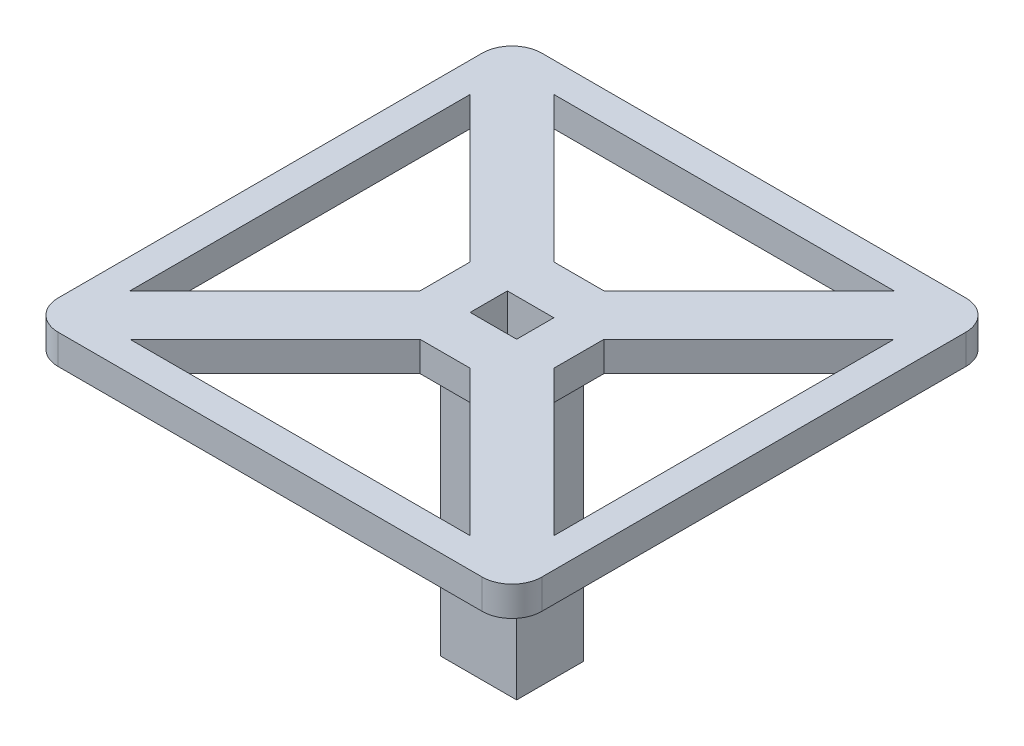
ISO-10303-21;
HEADER;
FILE_DESCRIPTION(('STEP AP214'),'2;1');
FILE_NAME('part.step','',(''),(''),'','','');
FILE_SCHEMA(('AUTOMOTIVE_DESIGN { 1 0 10303 214 1 1 1 1 }'));
ENDSEC;
DATA;
#1=APPLICATION_CONTEXT('core data for automotive mechanical design processes');
#2=APPLICATION_PROTOCOL_DEFINITION('international standard','automotive_design',2000,#1);
#3=PRODUCT_CONTEXT('',#1,'mechanical');
#4=PRODUCT('Part','Part','',(#3));
#5=PRODUCT_RELATED_PRODUCT_CATEGORY('part','',(#4));
#6=PRODUCT_DEFINITION_FORMATION('','',#4);
#7=PRODUCT_DEFINITION_CONTEXT('part definition',#1,'design');
#8=PRODUCT_DEFINITION('design','',#6,#7);
#9=PRODUCT_DEFINITION_SHAPE('','',#8);
#10=(LENGTH_UNIT() NAMED_UNIT(*) SI_UNIT(.MILLI.,.METRE.));
#11=(NAMED_UNIT(*) PLANE_ANGLE_UNIT() SI_UNIT($,.RADIAN.));
#12=(NAMED_UNIT(*) SI_UNIT($,.STERADIAN.) SOLID_ANGLE_UNIT());
#13=UNCERTAINTY_MEASURE_WITH_UNIT(LENGTH_MEASURE(1.E-05),#10,'distance_accuracy_value','');
#14=(GEOMETRIC_REPRESENTATION_CONTEXT(3) GLOBAL_UNCERTAINTY_ASSIGNED_CONTEXT((#13)) GLOBAL_UNIT_ASSIGNED_CONTEXT((#10,
#11,#12)) REPRESENTATION_CONTEXT('',''));
#15=CARTESIAN_POINT('',(0.,0.,0.));
#16=DIRECTION('',(0.,0.,1.));
#17=DIRECTION('',(1.,0.,0.));
#18=AXIS2_PLACEMENT_3D('',#15,#16,#17);
#19=CARTESIAN_POINT('',(0.,25.4,0.));
#20=DIRECTION('',(0.,-1.,0.));
#21=DIRECTION('',(0.,0.,-1.));
#22=AXIS2_PLACEMENT_3D('',#19,#20,#21);
#23=PLANE('',#22);
#24=DIRECTION('',(-0.707106781186547,0.,-0.707106781186547));
#25=VECTOR('',#24,1.);
#26=CARTESIAN_POINT('',(14.5053975515723,25.4,18.0975));
#27=LINE('',#26,#25);
#28=CARTESIAN_POINT('',(14.5053975515723,25.4,18.0975));
#29=VERTEX_POINT('',#28);
#30=CARTESIAN_POINT('',(2.12289755157234,25.4,5.715));
#31=VERTEX_POINT('',#30);
#32=EDGE_CURVE('E279',#29,#31,#27,.T.);
#33=ORIENTED_EDGE('',*,*,#32,.F.);
#34=DIRECTION('',(1.,0.,0.));
#35=VECTOR('',#34,1.);
#36=CARTESIAN_POINT('',(-14.5053975515723,25.4,18.0975));
#37=LINE('',#36,#35);
#38=CARTESIAN_POINT('',(-14.5053975515723,25.4,18.0975));
#39=VERTEX_POINT('',#38);
#40=EDGE_CURVE('E275',#39,#29,#37,.T.);
#41=ORIENTED_EDGE('',*,*,#40,.F.);
#42=DIRECTION('',(-0.707106781186548,0.,0.707106781186548));
#43=VECTOR('',#42,1.);
#44=CARTESIAN_POINT('',(-14.5053975515723,25.4,18.0975));
#45=LINE('',#44,#43);
#46=CARTESIAN_POINT('',(-2.12289755157233,25.4,5.715));
#47=VERTEX_POINT('',#46);
#48=EDGE_CURVE('E285',#47,#39,#45,.T.);
#49=ORIENTED_EDGE('',*,*,#48,.F.);
#50=DIRECTION('',(-1.,0.,0.));
#51=VECTOR('',#50,1.);
#52=CARTESIAN_POINT('',(-2.12289755157233,25.4,5.715));
#53=LINE('',#52,#51);
#54=EDGE_CURVE('E282',#31,#47,#53,.T.);
#55=ORIENTED_EDGE('',*,*,#54,.F.);
#56=EDGE_LOOP('',(#33,#41,#49,#55));
#57=FACE_BOUND('',#56,.T.);
#58=DIRECTION('',(-0.707106781186547,0.,-0.707106781186547));
#59=VECTOR('',#58,1.);
#60=CARTESIAN_POINT('',(-5.715,25.4,-2.12289755157233));
#61=LINE('',#60,#59);
#62=CARTESIAN_POINT('',(-5.715,25.4,-2.12289755157233));
#63=VERTEX_POINT('',#62);
#64=CARTESIAN_POINT('',(-18.0975,25.4,-14.5053975515723));
#65=VERTEX_POINT('',#64);
#66=EDGE_CURVE('E299',#63,#65,#61,.T.);
#67=ORIENTED_EDGE('',*,*,#66,.F.);
#68=DIRECTION('',(0.,0.,-1.));
#69=VECTOR('',#68,1.);
#70=CARTESIAN_POINT('',(-5.715,25.4,2.12289755157234));
#71=LINE('',#70,#69);
#72=CARTESIAN_POINT('',(-5.715,25.4,2.12289755157234));
#73=VERTEX_POINT('',#72);
#74=EDGE_CURVE('E291',#73,#63,#71,.T.);
#75=ORIENTED_EDGE('',*,*,#74,.F.);
#76=DIRECTION('',(0.707106781186547,0.,-0.707106781186547));
#77=VECTOR('',#76,1.);
#78=CARTESIAN_POINT('',(-18.0975,25.4,14.5053975515723));
#79=LINE('',#78,#77);
#80=CARTESIAN_POINT('',(-18.0975,25.4,14.5053975515723));
#81=VERTEX_POINT('',#80);
#82=EDGE_CURVE('E305',#81,#73,#79,.T.);
#83=ORIENTED_EDGE('',*,*,#82,.F.);
#84=DIRECTION('',(0.,0.,1.));
#85=VECTOR('',#84,1.);
#86=CARTESIAN_POINT('',(-18.0975,25.4,-14.5053975515723));
#87=LINE('',#86,#85);
#88=EDGE_CURVE('E302',#65,#81,#87,.T.);
#89=ORIENTED_EDGE('',*,*,#88,.F.);
#90=EDGE_LOOP('',(#67,#75,#83,#89));
#91=FACE_BOUND('',#90,.T.);
#92=DIRECTION('',(-0.707106781186548,0.,0.707106781186548));
#93=VECTOR('',#92,1.);
#94=CARTESIAN_POINT('',(18.0975,25.4,-14.5053975515723));
#95=LINE('',#94,#93);
#96=CARTESIAN_POINT('',(18.0975,25.4,-14.5053975515723));
#97=VERTEX_POINT('',#96);
#98=CARTESIAN_POINT('',(5.715,25.4,-2.12289755157233));
#99=VERTEX_POINT('',#98);
#100=EDGE_CURVE('E259',#97,#99,#95,.T.);
#101=ORIENTED_EDGE('',*,*,#100,.F.);
#102=DIRECTION('',(0.,0.,-1.));
#103=VECTOR('',#102,1.);
#104=CARTESIAN_POINT('',(18.0975,25.4,-14.5053975515723));
#105=LINE('',#104,#103);
#106=CARTESIAN_POINT('',(18.0975,25.4,14.5053975515723));
#107=VERTEX_POINT('',#106);
#108=EDGE_CURVE('E264',#107,#97,#105,.T.);
#109=ORIENTED_EDGE('',*,*,#108,.F.);
#110=DIRECTION('',(0.707106781186547,0.,0.707106781186547));
#111=VECTOR('',#110,1.);
#112=CARTESIAN_POINT('',(18.0975,25.4,14.5053975515723));
#113=LINE('',#112,#111);
#114=CARTESIAN_POINT('',(5.715,25.4,2.12289755157234));
#115=VERTEX_POINT('',#114);
#116=EDGE_CURVE('E268',#115,#107,#113,.T.);
#117=ORIENTED_EDGE('',*,*,#116,.F.);
#118=DIRECTION('',(0.,0.,1.));
#119=VECTOR('',#118,1.);
#120=CARTESIAN_POINT('',(5.715,25.4,2.12289755157234));
#121=LINE('',#120,#119);
#122=EDGE_CURVE('E248',#99,#115,#121,.T.);
#123=ORIENTED_EDGE('',*,*,#122,.F.);
#124=EDGE_LOOP('',(#101,#109,#117,#123));
#125=FACE_BOUND('',#124,.T.);
#126=DIRECTION('',(0.707106781186548,0.,-0.707106781186548));
#127=VECTOR('',#126,1.);
#128=CARTESIAN_POINT('',(14.5053975515723,25.4,-18.0975));
#129=LINE('',#128,#127);
#130=CARTESIAN_POINT('',(2.12289755157234,25.4,-5.715));
#131=VERTEX_POINT('',#130);
#132=CARTESIAN_POINT('',(14.5053975515723,25.4,-18.0975));
#133=VERTEX_POINT('',#132);
#134=EDGE_CURVE('E319',#131,#133,#129,.T.);
#135=ORIENTED_EDGE('',*,*,#134,.F.);
#136=DIRECTION('',(1.,0.,0.));
#137=VECTOR('',#136,1.);
#138=CARTESIAN_POINT('',(-2.12289755157234,25.4,-5.715));
#139=LINE('',#138,#137);
#140=CARTESIAN_POINT('',(-2.12289755157234,25.4,-5.715));
#141=VERTEX_POINT('',#140);
#142=EDGE_CURVE('E311',#141,#131,#139,.T.);
#143=ORIENTED_EDGE('',*,*,#142,.F.);
#144=DIRECTION('',(0.707106781186548,0.,0.707106781186547));
#145=VECTOR('',#144,1.);
#146=CARTESIAN_POINT('',(-2.12289755157234,25.4,-5.715));
#147=LINE('',#146,#145);
#148=CARTESIAN_POINT('',(-14.5053975515723,25.4,-18.0975));
#149=VERTEX_POINT('',#148);
#150=EDGE_CURVE('E325',#149,#141,#147,.T.);
#151=ORIENTED_EDGE('',*,*,#150,.F.);
#152=DIRECTION('',(-1.,0.,0.));
#153=VECTOR('',#152,1.);
#154=CARTESIAN_POINT('',(-14.5053975515723,25.4,-18.0975));
#155=LINE('',#154,#153);
#156=EDGE_CURVE('E322',#133,#149,#155,.T.);
#157=ORIENTED_EDGE('',*,*,#156,.F.);
#158=EDGE_LOOP('',(#135,#143,#151,#157));
#159=FACE_BOUND('',#158,.T.);
#160=DIRECTION('',(0.,0.,-1.));
#161=VECTOR('',#160,1.);
#162=CARTESIAN_POINT('',(1.984375,25.4,1.5875));
#163=LINE('',#162,#161);
#164=CARTESIAN_POINT('',(1.984375,25.4,1.5875));
#165=VERTEX_POINT('',#164);
#166=CARTESIAN_POINT('',(1.984375,25.4,-1.5875));
#167=VERTEX_POINT('',#166);
#168=EDGE_CURVE('E369',#165,#167,#163,.T.);
#169=ORIENTED_EDGE('',*,*,#168,.F.);
#170=DIRECTION('',(1.,0.,0.));
#171=VECTOR('',#170,1.);
#172=CARTESIAN_POINT('',(-1.984375,25.4,1.5875));
#173=LINE('',#172,#171);
#174=CARTESIAN_POINT('',(-1.984375,25.4,1.5875));
#175=VERTEX_POINT('',#174);
#176=EDGE_CURVE('E377',#175,#165,#173,.T.);
#177=ORIENTED_EDGE('',*,*,#176,.F.);
#178=DIRECTION('',(0.,0.,1.));
#179=VECTOR('',#178,1.);
#180=CARTESIAN_POINT('',(-1.984375,25.4,1.5875));
#181=LINE('',#180,#179);
#182=CARTESIAN_POINT('',(-1.984375,25.4,-1.5875));
#183=VERTEX_POINT('',#182);
#184=EDGE_CURVE('E374',#183,#175,#181,.T.);
#185=ORIENTED_EDGE('',*,*,#184,.F.);
#186=DIRECTION('',(-1.,0.,0.));
#187=VECTOR('',#186,1.);
#188=CARTESIAN_POINT('',(-1.984375,25.4,-1.5875));
#189=LINE('',#188,#187);
#190=EDGE_CURVE('E371',#167,#183,#189,.T.);
#191=ORIENTED_EDGE('',*,*,#190,.F.);
#192=EDGE_LOOP('',(#169,#177,#185,#191));
#193=FACE_BOUND('',#192,.T.);
#194=DIRECTION('',(0.,0.,-1.));
#195=VECTOR('',#194,1.);
#196=CARTESIAN_POINT('',(20.6375,25.4,20.6375));
#197=LINE('',#196,#195);
#198=CARTESIAN_POINT('',(20.6375,25.4,18.0975));
#199=VERTEX_POINT('',#198);
#200=CARTESIAN_POINT('',(20.6375,25.4,-18.0975));
#201=VERTEX_POINT('',#200);
#202=EDGE_CURVE('E345',#199,#201,#197,.T.);
#203=ORIENTED_EDGE('',*,*,#202,.T.);
#204=CARTESIAN_POINT('',(18.0975,25.4,-18.0975));
#205=DIRECTION('',(0.,-1.,0.));
#206=DIRECTION('',(0.,0.,-1.));
#207=AXIS2_PLACEMENT_3D('',#204,#205,#206);
#208=CIRCLE('',#207,2.54);
#209=CARTESIAN_POINT('',(18.0975,25.4,-20.6375));
#210=VERTEX_POINT('',#209);
#211=EDGE_CURVE('E464',#201,#210,#208,.F.);
#212=ORIENTED_EDGE('',*,*,#211,.T.);
#213=DIRECTION('',(-1.,0.,0.));
#214=VECTOR('',#213,1.);
#215=CARTESIAN_POINT('',(-20.6375,25.4,-20.6375));
#216=LINE('',#215,#214);
#217=CARTESIAN_POINT('',(-18.0975,25.4,-20.6375));
#218=VERTEX_POINT('',#217);
#219=EDGE_CURVE('E361',#210,#218,#216,.T.);
#220=ORIENTED_EDGE('',*,*,#219,.T.);
#221=CARTESIAN_POINT('',(-18.0975,25.4,-18.0975));
#222=DIRECTION('',(0.,-1.,0.));
#223=DIRECTION('',(0.,0.,-1.));
#224=AXIS2_PLACEMENT_3D('',#221,#222,#223);
#225=CIRCLE('',#224,2.54);
#226=CARTESIAN_POINT('',(-20.6375,25.4,-18.0975));
#227=VERTEX_POINT('',#226);
#228=EDGE_CURVE('E458',#218,#227,#225,.F.);
#229=ORIENTED_EDGE('',*,*,#228,.T.);
#230=DIRECTION('',(0.,0.,1.));
#231=VECTOR('',#230,1.);
#232=CARTESIAN_POINT('',(-20.6375,25.4,20.6375));
#233=LINE('',#232,#231);
#234=CARTESIAN_POINT('',(-20.6375,25.4,18.0975));
#235=VERTEX_POINT('',#234);
#236=EDGE_CURVE('E364',#227,#235,#233,.T.);
#237=ORIENTED_EDGE('',*,*,#236,.T.);
#238=CARTESIAN_POINT('',(-18.0975,25.4,18.0975));
#239=DIRECTION('',(0.,-1.,0.));
#240=DIRECTION('',(0.,0.,-1.));
#241=AXIS2_PLACEMENT_3D('',#238,#239,#240);
#242=CIRCLE('',#241,2.54);
#243=CARTESIAN_POINT('',(-18.0975,25.4,20.6375));
#244=VERTEX_POINT('',#243);
#245=EDGE_CURVE('E460',#235,#244,#242,.F.);
#246=ORIENTED_EDGE('',*,*,#245,.T.);
#247=DIRECTION('',(1.,0.,0.));
#248=VECTOR('',#247,1.);
#249=CARTESIAN_POINT('',(-20.6375,25.4,20.6375));
#250=LINE('',#249,#248);
#251=CARTESIAN_POINT('',(18.0975,25.4,20.6375));
#252=VERTEX_POINT('',#251);
#253=EDGE_CURVE('E350',#244,#252,#250,.T.);
#254=ORIENTED_EDGE('',*,*,#253,.T.);
#255=CARTESIAN_POINT('',(18.0975,25.4,18.0975));
#256=DIRECTION('',(0.,-1.,0.));
#257=DIRECTION('',(0.,0.,-1.));
#258=AXIS2_PLACEMENT_3D('',#255,#256,#257);
#259=CIRCLE('',#258,2.54);
#260=EDGE_CURVE('E462',#252,#199,#259,.F.);
#261=ORIENTED_EDGE('',*,*,#260,.T.);
#262=EDGE_LOOP('',(#203,#212,#220,#229,#237,#246,#254,#261));
#263=FACE_BOUND('',#262,.T.);
#264=ADVANCED_FACE('F33',(#57,#91,#125,#159,#193,#263),#23,.F.);
#265=CARTESIAN_POINT('',(0.,0.,0.));
#266=DIRECTION('',(0.,-1.,0.));
#267=DIRECTION('',(0.,0.,-1.));
#268=AXIS2_PLACEMENT_3D('',#265,#266,#267);
#269=PLANE('',#268);
#270=DIRECTION('',(0.,0.,-1.));
#271=VECTOR('',#270,1.);
#272=CARTESIAN_POINT('',(3.254375,0.,2.8575));
#273=LINE('',#272,#271);
#274=CARTESIAN_POINT('',(3.254375,0.,2.8575));
#275=VERTEX_POINT('',#274);
#276=CARTESIAN_POINT('',(3.254375,0.,-2.8575));
#277=VERTEX_POINT('',#276);
#278=EDGE_CURVE('E399',#275,#277,#273,.T.);
#279=ORIENTED_EDGE('',*,*,#278,.F.);
#280=DIRECTION('',(1.,0.,0.));
#281=VECTOR('',#280,1.);
#282=CARTESIAN_POINT('',(-3.254375,0.,2.8575));
#283=LINE('',#282,#281);
#284=CARTESIAN_POINT('',(-3.254375,0.,2.8575));
#285=VERTEX_POINT('',#284);
#286=EDGE_CURVE('E408',#285,#275,#283,.T.);
#287=ORIENTED_EDGE('',*,*,#286,.F.);
#288=DIRECTION('',(0.,0.,1.));
#289=VECTOR('',#288,1.);
#290=CARTESIAN_POINT('',(-3.254375,0.,2.8575));
#291=LINE('',#290,#289);
#292=CARTESIAN_POINT('',(-3.254375,0.,-2.8575));
#293=VERTEX_POINT('',#292);
#294=EDGE_CURVE('E405',#293,#285,#291,.T.);
#295=ORIENTED_EDGE('',*,*,#294,.F.);
#296=DIRECTION('',(-1.,0.,0.));
#297=VECTOR('',#296,1.);
#298=CARTESIAN_POINT('',(-3.254375,0.,-2.8575));
#299=LINE('',#298,#297);
#300=EDGE_CURVE('E402',#277,#293,#299,.T.);
#301=ORIENTED_EDGE('',*,*,#300,.F.);
#302=EDGE_LOOP('',(#279,#287,#295,#301));
#303=FACE_BOUND('',#302,.T.);
#304=DIRECTION('',(1.,0.,0.));
#305=VECTOR('',#304,1.);
#306=CARTESIAN_POINT('',(-1.984375,0.,1.5875));
#307=LINE('',#306,#305);
#308=CARTESIAN_POINT('',(-1.984375,0.,1.5875));
#309=VERTEX_POINT('',#308);
#310=CARTESIAN_POINT('',(1.984375,0.,1.5875));
#311=VERTEX_POINT('',#310);
#312=EDGE_CURVE('E372',#309,#311,#307,.T.);
#313=ORIENTED_EDGE('',*,*,#312,.T.);
#314=DIRECTION('',(0.,0.,-1.));
#315=VECTOR('',#314,1.);
#316=CARTESIAN_POINT('',(1.984375,0.,1.5875));
#317=LINE('',#316,#315);
#318=CARTESIAN_POINT('',(1.984375,0.,-1.5875));
#319=VERTEX_POINT('',#318);
#320=EDGE_CURVE('E358',#311,#319,#317,.T.);
#321=ORIENTED_EDGE('',*,*,#320,.T.);
#322=DIRECTION('',(-1.,0.,0.));
#323=VECTOR('',#322,1.);
#324=CARTESIAN_POINT('',(-1.984375,0.,-1.5875));
#325=LINE('',#324,#323);
#326=CARTESIAN_POINT('',(-1.984375,0.,-1.5875));
#327=VERTEX_POINT('',#326);
#328=EDGE_CURVE('E382',#319,#327,#325,.T.);
#329=ORIENTED_EDGE('',*,*,#328,.T.);
#330=DIRECTION('',(0.,0.,1.));
#331=VECTOR('',#330,1.);
#332=CARTESIAN_POINT('',(-1.984375,0.,1.5875));
#333=LINE('',#332,#331);
#334=EDGE_CURVE('E385',#327,#309,#333,.T.);
#335=ORIENTED_EDGE('',*,*,#334,.T.);
#336=EDGE_LOOP('',(#313,#321,#329,#335));
#337=FACE_BOUND('',#336,.T.);
#338=ADVANCED_FACE('F522',(#303,#337),#269,.T.);
#339=CARTESIAN_POINT('',(3.254375,25.4,2.8575));
#340=DIRECTION('',(-1.,0.,0.));
#341=DIRECTION('',(0.,0.,1.));
#342=AXIS2_PLACEMENT_3D('',#339,#340,#341);
#343=PLANE('',#342);
#344=DIRECTION('',(0.,-1.,0.));
#345=VECTOR('',#344,1.);
#346=CARTESIAN_POINT('',(3.254375,25.4,-2.8575));
#347=LINE('',#346,#345);
#348=CARTESIAN_POINT('',(3.254375,22.86,-2.8575));
#349=VERTEX_POINT('',#348);
#350=EDGE_CURVE('E417',#349,#277,#347,.T.);
#351=ORIENTED_EDGE('',*,*,#350,.F.);
#352=DIRECTION('',(0.,0.,-1.));
#353=VECTOR('',#352,1.);
#354=CARTESIAN_POINT('',(3.254375,22.86,2.8575));
#355=LINE('',#354,#353);
#356=CARTESIAN_POINT('',(3.254375,22.86,2.8575));
#357=VERTEX_POINT('',#356);
#358=EDGE_CURVE('E341',#357,#349,#355,.T.);
#359=ORIENTED_EDGE('',*,*,#358,.F.);
#360=DIRECTION('',(0.,-1.,0.));
#361=VECTOR('',#360,1.);
#362=CARTESIAN_POINT('',(3.254375,25.4,2.8575));
#363=LINE('',#362,#361);
#364=EDGE_CURVE('E411',#357,#275,#363,.T.);
#365=ORIENTED_EDGE('',*,*,#364,.T.);
#366=ORIENTED_EDGE('',*,*,#278,.T.);
#367=EDGE_LOOP('',(#351,#359,#365,#366));
#368=FACE_BOUND('',#367,.T.);
#369=ADVANCED_FACE('F528',(#368),#343,.F.);
#370=CARTESIAN_POINT('',(-3.254375,25.4,-2.8575));
#371=DIRECTION('',(0.,0.,1.));
#372=DIRECTION('',(1.,0.,0.));
#373=AXIS2_PLACEMENT_3D('',#370,#371,#372);
#374=PLANE('',#373);
#375=DIRECTION('',(0.,-1.,0.));
#376=VECTOR('',#375,1.);
#377=CARTESIAN_POINT('',(-3.254375,25.4,-2.8575));
#378=LINE('',#377,#376);
#379=CARTESIAN_POINT('',(-3.254375,22.86,-2.8575));
#380=VERTEX_POINT('',#379);
#381=EDGE_CURVE('E415',#380,#293,#378,.T.);
#382=ORIENTED_EDGE('',*,*,#381,.F.);
#383=DIRECTION('',(-1.,0.,0.));
#384=VECTOR('',#383,1.);
#385=CARTESIAN_POINT('',(3.254375,22.86,-2.8575));
#386=LINE('',#385,#384);
#387=EDGE_CURVE('E343',#349,#380,#386,.T.);
#388=ORIENTED_EDGE('',*,*,#387,.F.);
#389=ORIENTED_EDGE('',*,*,#350,.T.);
#390=ORIENTED_EDGE('',*,*,#300,.T.);
#391=EDGE_LOOP('',(#382,#388,#389,#390));
#392=FACE_BOUND('',#391,.T.);
#393=ADVANCED_FACE('F544',(#392),#374,.F.);
#394=CARTESIAN_POINT('',(-3.254375,25.4,2.8575));
#395=DIRECTION('',(1.,0.,0.));
#396=DIRECTION('',(0.,0.,-1.));
#397=AXIS2_PLACEMENT_3D('',#394,#395,#396);
#398=PLANE('',#397);
#399=DIRECTION('',(0.,-1.,0.));
#400=VECTOR('',#399,1.);
#401=CARTESIAN_POINT('',(-3.254375,25.4,2.8575));
#402=LINE('',#401,#400);
#403=CARTESIAN_POINT('',(-3.254375,22.86,2.8575));
#404=VERTEX_POINT('',#403);
#405=EDGE_CURVE('E413',#404,#285,#402,.T.);
#406=ORIENTED_EDGE('',*,*,#405,.F.);
#407=DIRECTION('',(0.,0.,1.));
#408=VECTOR('',#407,1.);
#409=CARTESIAN_POINT('',(-3.254375,22.86,-2.8575));
#410=LINE('',#409,#408);
#411=EDGE_CURVE('E331',#380,#404,#410,.T.);
#412=ORIENTED_EDGE('',*,*,#411,.F.);
#413=ORIENTED_EDGE('',*,*,#381,.T.);
#414=ORIENTED_EDGE('',*,*,#294,.T.);
#415=EDGE_LOOP('',(#406,#412,#413,#414));
#416=FACE_BOUND('',#415,.T.);
#417=ADVANCED_FACE('F540',(#416),#398,.F.);
#418=CARTESIAN_POINT('',(-3.254375,25.4,2.8575));
#419=DIRECTION('',(0.,0.,-1.));
#420=DIRECTION('',(-1.,0.,0.));
#421=AXIS2_PLACEMENT_3D('',#418,#419,#420);
#422=PLANE('',#421);
#423=ORIENTED_EDGE('',*,*,#364,.F.);
#424=DIRECTION('',(1.,0.,0.));
#425=VECTOR('',#424,1.);
#426=CARTESIAN_POINT('',(-3.254375,22.86,2.8575));
#427=LINE('',#426,#425);
#428=EDGE_CURVE('E339',#404,#357,#427,.T.);
#429=ORIENTED_EDGE('',*,*,#428,.F.);
#430=ORIENTED_EDGE('',*,*,#405,.T.);
#431=ORIENTED_EDGE('',*,*,#286,.T.);
#432=EDGE_LOOP('',(#423,#429,#430,#431));
#433=FACE_BOUND('',#432,.T.);
#434=ADVANCED_FACE('F537',(#433),#422,.F.);
#435=CARTESIAN_POINT('',(1.984375,25.4,1.5875));
#436=DIRECTION('',(-1.,0.,0.));
#437=DIRECTION('',(0.,0.,1.));
#438=AXIS2_PLACEMENT_3D('',#435,#436,#437);
#439=PLANE('',#438);
#440=ORIENTED_EDGE('',*,*,#320,.F.);
#441=DIRECTION('',(0.,-1.,0.));
#442=VECTOR('',#441,1.);
#443=CARTESIAN_POINT('',(1.984375,25.4,1.5875));
#444=LINE('',#443,#442);
#445=EDGE_CURVE('E379',#165,#311,#444,.T.);
#446=ORIENTED_EDGE('',*,*,#445,.F.);
#447=ORIENTED_EDGE('',*,*,#168,.T.);
#448=DIRECTION('',(0.,-1.,0.));
#449=VECTOR('',#448,1.);
#450=CARTESIAN_POINT('',(1.984375,25.4,-1.5875));
#451=LINE('',#450,#449);
#452=EDGE_CURVE('E396',#167,#319,#451,.T.);
#453=ORIENTED_EDGE('',*,*,#452,.T.);
#454=EDGE_LOOP('',(#440,#446,#447,#453));
#455=FACE_BOUND('',#454,.T.);
#456=ADVANCED_FACE('F534',(#455),#439,.T.);
#457=CARTESIAN_POINT('',(-1.984375,25.4,-1.5875));
#458=DIRECTION('',(0.,0.,1.));
#459=DIRECTION('',(1.,0.,0.));
#460=AXIS2_PLACEMENT_3D('',#457,#458,#459);
#461=PLANE('',#460);
#462=ORIENTED_EDGE('',*,*,#328,.F.);
#463=ORIENTED_EDGE('',*,*,#452,.F.);
#464=ORIENTED_EDGE('',*,*,#190,.T.);
#465=DIRECTION('',(0.,-1.,0.));
#466=VECTOR('',#465,1.);
#467=CARTESIAN_POINT('',(-1.984375,25.4,-1.5875));
#468=LINE('',#467,#466);
#469=EDGE_CURVE('E394',#183,#327,#468,.T.);
#470=ORIENTED_EDGE('',*,*,#469,.T.);
#471=EDGE_LOOP('',(#462,#463,#464,#470));
#472=FACE_BOUND('',#471,.T.);
#473=ADVANCED_FACE('F595',(#472),#461,.T.);
#474=CARTESIAN_POINT('',(-1.984375,25.4,1.5875));
#475=DIRECTION('',(1.,0.,0.));
#476=DIRECTION('',(0.,0.,-1.));
#477=AXIS2_PLACEMENT_3D('',#474,#475,#476);
#478=PLANE('',#477);
#479=ORIENTED_EDGE('',*,*,#334,.F.);
#480=ORIENTED_EDGE('',*,*,#469,.F.);
#481=ORIENTED_EDGE('',*,*,#184,.T.);
#482=DIRECTION('',(0.,-1.,0.));
#483=VECTOR('',#482,1.);
#484=CARTESIAN_POINT('',(-1.984375,25.4,1.5875));
#485=LINE('',#484,#483);
#486=EDGE_CURVE('E392',#175,#309,#485,.T.);
#487=ORIENTED_EDGE('',*,*,#486,.T.);
#488=EDGE_LOOP('',(#479,#480,#481,#487));
#489=FACE_BOUND('',#488,.T.);
#490=ADVANCED_FACE('F592',(#489),#478,.T.);
#491=CARTESIAN_POINT('',(-1.984375,25.4,1.5875));
#492=DIRECTION('',(0.,0.,-1.));
#493=DIRECTION('',(-1.,0.,0.));
#494=AXIS2_PLACEMENT_3D('',#491,#492,#493);
#495=PLANE('',#494);
#496=ORIENTED_EDGE('',*,*,#312,.F.);
#497=ORIENTED_EDGE('',*,*,#486,.F.);
#498=ORIENTED_EDGE('',*,*,#176,.T.);
#499=ORIENTED_EDGE('',*,*,#445,.T.);
#500=EDGE_LOOP('',(#496,#497,#498,#499));
#501=FACE_BOUND('',#500,.T.);
#502=ADVANCED_FACE('F589',(#501),#495,.T.);
#503=CARTESIAN_POINT('',(20.6375,22.86,20.6375));
#504=DIRECTION('',(1.,0.,0.));
#505=DIRECTION('',(0.,0.,-1.));
#506=AXIS2_PLACEMENT_3D('',#503,#504,#505);
#507=PLANE('',#506);
#508=DIRECTION('',(0.,0.,-1.));
#509=VECTOR('',#508,1.);
#510=CARTESIAN_POINT('',(20.6375,22.86,20.6375));
#511=LINE('',#510,#509);
#512=CARTESIAN_POINT('',(20.6375,22.86,18.0975));
#513=VERTEX_POINT('',#512);
#514=CARTESIAN_POINT('',(20.6375,22.86,-18.0975));
#515=VERTEX_POINT('',#514);
#516=EDGE_CURVE('E346',#513,#515,#511,.T.);
#517=ORIENTED_EDGE('',*,*,#516,.T.);
#518=DIRECTION('',(0.,1.,0.));
#519=VECTOR('',#518,1.);
#520=CARTESIAN_POINT('',(20.6375,22.86,-18.0975));
#521=LINE('',#520,#519);
#522=EDGE_CURVE('E455',#515,#201,#521,.T.);
#523=ORIENTED_EDGE('',*,*,#522,.T.);
#524=ORIENTED_EDGE('',*,*,#202,.F.);
#525=DIRECTION('',(0.,1.,0.));
#526=VECTOR('',#525,1.);
#527=CARTESIAN_POINT('',(20.6375,22.86,18.0975));
#528=LINE('',#527,#526);
#529=EDGE_CURVE('E453',#199,#513,#528,.F.);
#530=ORIENTED_EDGE('',*,*,#529,.T.);
#531=EDGE_LOOP('',(#517,#523,#524,#530));
#532=FACE_BOUND('',#531,.T.);
#533=ADVANCED_FACE('F509',(#532),#507,.T.);
#534=CARTESIAN_POINT('',(-20.6375,22.86,20.6375));
#535=DIRECTION('',(0.,0.,1.));
#536=DIRECTION('',(1.,0.,0.));
#537=AXIS2_PLACEMENT_3D('',#534,#535,#536);
#538=PLANE('',#537);
#539=DIRECTION('',(1.,0.,0.));
#540=VECTOR('',#539,1.);
#541=CARTESIAN_POINT('',(-20.6375,22.86,20.6375));
#542=LINE('',#541,#540);
#543=CARTESIAN_POINT('',(-18.0975,22.86,20.6375));
#544=VERTEX_POINT('',#543);
#545=CARTESIAN_POINT('',(18.0975,22.86,20.6375));
#546=VERTEX_POINT('',#545);
#547=EDGE_CURVE('E355',#544,#546,#542,.T.);
#548=ORIENTED_EDGE('',*,*,#547,.T.);
#549=DIRECTION('',(0.,1.,0.));
#550=VECTOR('',#549,1.);
#551=CARTESIAN_POINT('',(18.0975,22.86,20.6375));
#552=LINE('',#551,#550);
#553=EDGE_CURVE('E480',#546,#252,#552,.T.);
#554=ORIENTED_EDGE('',*,*,#553,.T.);
#555=ORIENTED_EDGE('',*,*,#253,.F.);
#556=DIRECTION('',(0.,1.,0.));
#557=VECTOR('',#556,1.);
#558=CARTESIAN_POINT('',(-18.0975,22.86,20.6375));
#559=LINE('',#558,#557);
#560=EDGE_CURVE('E478',#244,#544,#559,.F.);
#561=ORIENTED_EDGE('',*,*,#560,.T.);
#562=EDGE_LOOP('',(#548,#554,#555,#561));
#563=FACE_BOUND('',#562,.T.);
#564=ADVANCED_FACE('F485',(#563),#538,.T.);
#565=CARTESIAN_POINT('',(-20.6375,22.86,20.6375));
#566=DIRECTION('',(-1.,0.,0.));
#567=DIRECTION('',(0.,0.,1.));
#568=AXIS2_PLACEMENT_3D('',#565,#566,#567);
#569=PLANE('',#568);
#570=DIRECTION('',(0.,0.,1.));
#571=VECTOR('',#570,1.);
#572=CARTESIAN_POINT('',(-20.6375,22.86,20.6375));
#573=LINE('',#572,#571);
#574=CARTESIAN_POINT('',(-20.6375,22.86,-18.0975));
#575=VERTEX_POINT('',#574);
#576=CARTESIAN_POINT('',(-20.6375,22.86,18.0975));
#577=VERTEX_POINT('',#576);
#578=EDGE_CURVE('E353',#575,#577,#573,.T.);
#579=ORIENTED_EDGE('',*,*,#578,.T.);
#580=DIRECTION('',(0.,1.,0.));
#581=VECTOR('',#580,1.);
#582=CARTESIAN_POINT('',(-20.6375,22.86,18.0975));
#583=LINE('',#582,#581);
#584=EDGE_CURVE('E11',#577,#235,#583,.T.);
#585=ORIENTED_EDGE('',*,*,#584,.T.);
#586=ORIENTED_EDGE('',*,*,#236,.F.);
#587=DIRECTION('',(0.,1.,0.));
#588=VECTOR('',#587,1.);
#589=CARTESIAN_POINT('',(-20.6375,22.86,-18.0975));
#590=LINE('',#589,#588);
#591=EDGE_CURVE('E41',#227,#575,#590,.F.);
#592=ORIENTED_EDGE('',*,*,#591,.T.);
#593=EDGE_LOOP('',(#579,#585,#586,#592));
#594=FACE_BOUND('',#593,.T.);
#595=ADVANCED_FACE('F494',(#594),#569,.T.);
#596=CARTESIAN_POINT('',(-20.6375,22.86,-20.6375));
#597=DIRECTION('',(0.,0.,-1.));
#598=DIRECTION('',(-1.,0.,0.));
#599=AXIS2_PLACEMENT_3D('',#596,#597,#598);
#600=PLANE('',#599);
#601=ORIENTED_EDGE('',*,*,#219,.F.);
#602=DIRECTION('',(0.,1.,0.));
#603=VECTOR('',#602,1.);
#604=CARTESIAN_POINT('',(18.0975,22.86,-20.6375));
#605=LINE('',#604,#603);
#606=CARTESIAN_POINT('',(18.0975,22.86,-20.6375));
#607=VERTEX_POINT('',#606);
#608=EDGE_CURVE('E469',#210,#607,#605,.F.);
#609=ORIENTED_EDGE('',*,*,#608,.T.);
#610=DIRECTION('',(-1.,0.,0.));
#611=VECTOR('',#610,1.);
#612=CARTESIAN_POINT('',(-20.6375,22.86,-20.6375));
#613=LINE('',#612,#611);
#614=CARTESIAN_POINT('',(-18.0975,22.86,-20.6375));
#615=VERTEX_POINT('',#614);
#616=EDGE_CURVE('E349',#607,#615,#613,.T.);
#617=ORIENTED_EDGE('',*,*,#616,.T.);
#618=DIRECTION('',(0.,1.,0.));
#619=VECTOR('',#618,1.);
#620=CARTESIAN_POINT('',(-18.0975,22.86,-20.6375));
#621=LINE('',#620,#619);
#622=EDGE_CURVE('E466',#615,#218,#621,.T.);
#623=ORIENTED_EDGE('',*,*,#622,.T.);
#624=EDGE_LOOP('',(#601,#609,#617,#623));
#625=FACE_BOUND('',#624,.T.);
#626=ADVANCED_FACE('F502',(#625),#600,.T.);
#627=CARTESIAN_POINT('',(0.,22.86,0.));
#628=DIRECTION('',(0.,-1.,0.));
#629=DIRECTION('',(0.,0.,-1.));
#630=AXIS2_PLACEMENT_3D('',#627,#628,#629);
#631=PLANE('',#630);
#632=DIRECTION('',(-1.,0.,0.));
#633=VECTOR('',#632,1.);
#634=CARTESIAN_POINT('',(0.,22.86,18.0975));
#635=LINE('',#634,#633);
#636=CARTESIAN_POINT('',(14.5053975515723,22.86,18.0975));
#637=VERTEX_POINT('',#636);
#638=CARTESIAN_POINT('',(-14.5053975515723,22.86,18.0975));
#639=VERTEX_POINT('',#638);
#640=EDGE_CURVE('E451',#637,#639,#635,.T.);
#641=ORIENTED_EDGE('',*,*,#640,.F.);
#642=DIRECTION('',(0.707106781186548,0.,0.707106781186548));
#643=VECTOR('',#642,1.);
#644=CARTESIAN_POINT('',(-1.79605122421383,22.86,1.79605122421383));
#645=LINE('',#644,#643);
#646=CARTESIAN_POINT('',(2.12289755157234,22.86,5.715));
#647=VERTEX_POINT('',#646);
#648=EDGE_CURVE('E444',#647,#637,#645,.T.);
#649=ORIENTED_EDGE('',*,*,#648,.F.);
#650=DIRECTION('',(1.,0.,0.));
#651=VECTOR('',#650,1.);
#652=CARTESIAN_POINT('',(0.,22.86,5.715));
#653=LINE('',#652,#651);
#654=CARTESIAN_POINT('',(-2.12289755157233,22.86,5.715));
#655=VERTEX_POINT('',#654);
#656=EDGE_CURVE('E446',#655,#647,#653,.T.);
#657=ORIENTED_EDGE('',*,*,#656,.F.);
#658=DIRECTION('',(0.707106781186548,0.,-0.707106781186547));
#659=VECTOR('',#658,1.);
#660=CARTESIAN_POINT('',(1.79605122421384,22.86,1.79605122421384));
#661=LINE('',#660,#659);
#662=EDGE_CURVE('E449',#639,#655,#661,.T.);
#663=ORIENTED_EDGE('',*,*,#662,.F.);
#664=EDGE_LOOP('',(#641,#649,#657,#663));
#665=FACE_BOUND('',#664,.T.);
#666=DIRECTION('',(0.,0.,1.));
#667=VECTOR('',#666,1.);
#668=CARTESIAN_POINT('',(-5.715,22.86,0.));
#669=LINE('',#668,#667);
#670=CARTESIAN_POINT('',(-5.715,22.86,-2.12289755157233));
#671=VERTEX_POINT('',#670);
#672=CARTESIAN_POINT('',(-5.715,22.86,2.12289755157234));
#673=VERTEX_POINT('',#672);
#674=EDGE_CURVE('E442',#671,#673,#669,.T.);
#675=ORIENTED_EDGE('',*,*,#674,.F.);
#676=DIRECTION('',(0.707106781186548,0.,0.707106781186548));
#677=VECTOR('',#676,1.);
#678=CARTESIAN_POINT('',(-1.79605122421383,22.86,1.79605122421383));
#679=LINE('',#678,#677);
#680=CARTESIAN_POINT('',(-18.0975,22.86,-14.5053975515723));
#681=VERTEX_POINT('',#680);
#682=EDGE_CURVE('E435',#681,#671,#679,.T.);
#683=ORIENTED_EDGE('',*,*,#682,.F.);
#684=DIRECTION('',(0.,0.,-1.));
#685=VECTOR('',#684,1.);
#686=CARTESIAN_POINT('',(-18.0975,22.86,0.));
#687=LINE('',#686,#685);
#688=CARTESIAN_POINT('',(-18.0975,22.86,14.5053975515723));
#689=VERTEX_POINT('',#688);
#690=EDGE_CURVE('E437',#689,#681,#687,.T.);
#691=ORIENTED_EDGE('',*,*,#690,.F.);
#692=DIRECTION('',(-0.707106781186548,0.,0.707106781186548));
#693=VECTOR('',#692,1.);
#694=CARTESIAN_POINT('',(-1.79605122421383,22.86,-1.79605122421383));
#695=LINE('',#694,#693);
#696=EDGE_CURVE('E440',#673,#689,#695,.T.);
#697=ORIENTED_EDGE('',*,*,#696,.F.);
#698=EDGE_LOOP('',(#675,#683,#691,#697));
#699=FACE_BOUND('',#698,.T.);
#700=DIRECTION('',(0.,0.,1.));
#701=VECTOR('',#700,1.);
#702=CARTESIAN_POINT('',(18.0975,22.86,0.));
#703=LINE('',#702,#701);
#704=CARTESIAN_POINT('',(18.0975,22.86,-14.5053975515723));
#705=VERTEX_POINT('',#704);
#706=CARTESIAN_POINT('',(18.0975,22.86,14.5053975515723));
#707=VERTEX_POINT('',#706);
#708=EDGE_CURVE('E433',#705,#707,#703,.T.);
#709=ORIENTED_EDGE('',*,*,#708,.F.);
#710=DIRECTION('',(0.707106781186548,0.,-0.707106781186547));
#711=VECTOR('',#710,1.);
#712=CARTESIAN_POINT('',(1.79605122421383,22.86,1.79605122421383));
#713=LINE('',#712,#711);
#714=CARTESIAN_POINT('',(5.715,22.86,-2.12289755157233));
#715=VERTEX_POINT('',#714);
#716=EDGE_CURVE('E428',#715,#705,#713,.T.);
#717=ORIENTED_EDGE('',*,*,#716,.F.);
#718=DIRECTION('',(0.,0.,-1.));
#719=VECTOR('',#718,1.);
#720=CARTESIAN_POINT('',(5.715,22.86,0.));
#721=LINE('',#720,#719);
#722=CARTESIAN_POINT('',(5.715,22.86,2.12289755157234));
#723=VERTEX_POINT('',#722);
#724=EDGE_CURVE('E251',#723,#715,#721,.T.);
#725=ORIENTED_EDGE('',*,*,#724,.F.);
#726=DIRECTION('',(-0.707106781186548,0.,-0.707106781186548));
#727=VECTOR('',#726,1.);
#728=CARTESIAN_POINT('',(1.79605122421383,22.86,-1.79605122421383));
#729=LINE('',#728,#727);
#730=EDGE_CURVE('E431',#707,#723,#729,.T.);
#731=ORIENTED_EDGE('',*,*,#730,.F.);
#732=EDGE_LOOP('',(#709,#717,#725,#731));
#733=FACE_BOUND('',#732,.T.);
#734=DIRECTION('',(-1.,0.,0.));
#735=VECTOR('',#734,1.);
#736=CARTESIAN_POINT('',(0.,22.86,-5.715));
#737=LINE('',#736,#735);
#738=CARTESIAN_POINT('',(2.12289755157234,22.86,-5.715));
#739=VERTEX_POINT('',#738);
#740=CARTESIAN_POINT('',(-2.12289755157234,22.86,-5.715));
#741=VERTEX_POINT('',#740);
#742=EDGE_CURVE('E426',#739,#741,#737,.T.);
#743=ORIENTED_EDGE('',*,*,#742,.F.);
#744=DIRECTION('',(-0.707106781186548,0.,0.707106781186548));
#745=VECTOR('',#744,1.);
#746=CARTESIAN_POINT('',(-1.79605122421383,22.86,-1.79605122421383));
#747=LINE('',#746,#745);
#748=CARTESIAN_POINT('',(14.5053975515723,22.86,-18.0975));
#749=VERTEX_POINT('',#748);
#750=EDGE_CURVE('E419',#749,#739,#747,.T.);
#751=ORIENTED_EDGE('',*,*,#750,.F.);
#752=DIRECTION('',(1.,0.,0.));
#753=VECTOR('',#752,1.);
#754=CARTESIAN_POINT('',(0.,22.86,-18.0975));
#755=LINE('',#754,#753);
#756=CARTESIAN_POINT('',(-14.5053975515723,22.86,-18.0975));
#757=VERTEX_POINT('',#756);
#758=EDGE_CURVE('E421',#757,#749,#755,.T.);
#759=ORIENTED_EDGE('',*,*,#758,.F.);
#760=DIRECTION('',(-0.707106781186548,0.,-0.707106781186547));
#761=VECTOR('',#760,1.);
#762=CARTESIAN_POINT('',(1.79605122421383,22.86,-1.79605122421383));
#763=LINE('',#762,#761);
#764=EDGE_CURVE('E424',#741,#757,#763,.T.);
#765=ORIENTED_EDGE('',*,*,#764,.F.);
#766=EDGE_LOOP('',(#743,#751,#759,#765));
#767=FACE_BOUND('',#766,.T.);
#768=ORIENTED_EDGE('',*,*,#411,.T.);
#769=ORIENTED_EDGE('',*,*,#428,.T.);
#770=ORIENTED_EDGE('',*,*,#358,.T.);
#771=ORIENTED_EDGE('',*,*,#387,.T.);
#772=EDGE_LOOP('',(#768,#769,#770,#771));
#773=FACE_BOUND('',#772,.T.);
#774=ORIENTED_EDGE('',*,*,#616,.F.);
#775=CARTESIAN_POINT('',(18.0975,22.86,-18.0975));
#776=DIRECTION('',(0.,-1.,0.));
#777=DIRECTION('',(0.,0.,-1.));
#778=AXIS2_PLACEMENT_3D('',#775,#776,#777);
#779=CIRCLE('',#778,2.54);
#780=EDGE_CURVE('E476',#607,#515,#779,.T.);
#781=ORIENTED_EDGE('',*,*,#780,.T.);
#782=ORIENTED_EDGE('',*,*,#516,.F.);
#783=CARTESIAN_POINT('',(18.0975,22.86,18.0975));
#784=DIRECTION('',(0.,-1.,0.));
#785=DIRECTION('',(0.,0.,-1.));
#786=AXIS2_PLACEMENT_3D('',#783,#784,#785);
#787=CIRCLE('',#786,2.54);
#788=EDGE_CURVE('E474',#513,#546,#787,.T.);
#789=ORIENTED_EDGE('',*,*,#788,.T.);
#790=ORIENTED_EDGE('',*,*,#547,.F.);
#791=CARTESIAN_POINT('',(-18.0975,22.86,18.0975));
#792=DIRECTION('',(0.,-1.,0.));
#793=DIRECTION('',(0.,0.,-1.));
#794=AXIS2_PLACEMENT_3D('',#791,#792,#793);
#795=CIRCLE('',#794,2.54);
#796=EDGE_CURVE('E48',#544,#577,#795,.T.);
#797=ORIENTED_EDGE('',*,*,#796,.T.);
#798=ORIENTED_EDGE('',*,*,#578,.F.);
#799=CARTESIAN_POINT('',(-18.0975,22.86,-18.0975));
#800=DIRECTION('',(0.,-1.,0.));
#801=DIRECTION('',(0.,0.,-1.));
#802=AXIS2_PLACEMENT_3D('',#799,#800,#801);
#803=CIRCLE('',#802,2.54);
#804=EDGE_CURVE('E471',#575,#615,#803,.T.);
#805=ORIENTED_EDGE('',*,*,#804,.T.);
#806=EDGE_LOOP('',(#774,#781,#782,#789,#790,#797,#798,#805));
#807=FACE_BOUND('',#806,.T.);
#808=ADVANCED_FACE('F497',(#665,#699,#733,#767,#773,#807),#631,.T.);
#809=CARTESIAN_POINT('',(-2.12289755157234,0.,-5.715));
#810=DIRECTION('',(0.,0.,1.));
#811=DIRECTION('',(1.,0.,0.));
#812=AXIS2_PLACEMENT_3D('',#809,#810,#811);
#813=PLANE('',#812);
#814=ORIENTED_EDGE('',*,*,#742,.T.);
#815=DIRECTION('',(0.,1.,0.));
#816=VECTOR('',#815,1.);
#817=CARTESIAN_POINT('',(-2.12289755157234,0.,-5.715));
#818=LINE('',#817,#816);
#819=EDGE_CURVE('E329',#741,#141,#818,.T.);
#820=ORIENTED_EDGE('',*,*,#819,.T.);
#821=ORIENTED_EDGE('',*,*,#142,.T.);
#822=DIRECTION('',(0.,1.,0.));
#823=VECTOR('',#822,1.);
#824=CARTESIAN_POINT('',(2.12289755157234,0.,-5.715));
#825=LINE('',#824,#823);
#826=EDGE_CURVE('E328',#739,#131,#825,.T.);
#827=ORIENTED_EDGE('',*,*,#826,.F.);
#828=EDGE_LOOP('',(#814,#820,#821,#827));
#829=FACE_BOUND('',#828,.T.);
#830=ADVANCED_FACE('F568',(#829),#813,.F.);
#831=CARTESIAN_POINT('',(-2.12289755157234,0.,-5.715));
#832=DIRECTION('',(-0.707106781186547,0.,0.707106781186548));
#833=DIRECTION('',(0.707106781186548,0.,0.707106781186547));
#834=AXIS2_PLACEMENT_3D('',#831,#832,#833);
#835=PLANE('',#834);
#836=ORIENTED_EDGE('',*,*,#764,.T.);
#837=DIRECTION('',(0.,1.,0.));
#838=VECTOR('',#837,1.);
#839=CARTESIAN_POINT('',(-14.5053975515723,0.,-18.0975));
#840=LINE('',#839,#838);
#841=EDGE_CURVE('E332',#757,#149,#840,.T.);
#842=ORIENTED_EDGE('',*,*,#841,.T.);
#843=ORIENTED_EDGE('',*,*,#150,.T.);
#844=ORIENTED_EDGE('',*,*,#819,.F.);
#845=EDGE_LOOP('',(#836,#842,#843,#844));
#846=FACE_BOUND('',#845,.T.);
#847=ADVANCED_FACE('F575',(#846),#835,.F.);
#848=CARTESIAN_POINT('',(-14.5053975515723,0.,-18.0975));
#849=DIRECTION('',(0.,0.,-1.));
#850=DIRECTION('',(-1.,0.,0.));
#851=AXIS2_PLACEMENT_3D('',#848,#849,#850);
#852=PLANE('',#851);
#853=ORIENTED_EDGE('',*,*,#758,.T.);
#854=DIRECTION('',(0.,1.,0.));
#855=VECTOR('',#854,1.);
#856=CARTESIAN_POINT('',(14.5053975515723,0.,-18.0975));
#857=LINE('',#856,#855);
#858=EDGE_CURVE('E334',#749,#133,#857,.T.);
#859=ORIENTED_EDGE('',*,*,#858,.T.);
#860=ORIENTED_EDGE('',*,*,#156,.T.);
#861=ORIENTED_EDGE('',*,*,#841,.F.);
#862=EDGE_LOOP('',(#853,#859,#860,#861));
#863=FACE_BOUND('',#862,.T.);
#864=ADVANCED_FACE('F803',(#863),#852,.F.);
#865=CARTESIAN_POINT('',(14.5053975515723,0.,-18.0975));
#866=DIRECTION('',(0.707106781186548,0.,0.707106781186548));
#867=DIRECTION('',(0.707106781186548,0.,-0.707106781186548));
#868=AXIS2_PLACEMENT_3D('',#865,#866,#867);
#869=PLANE('',#868);
#870=ORIENTED_EDGE('',*,*,#750,.T.);
#871=ORIENTED_EDGE('',*,*,#826,.T.);
#872=ORIENTED_EDGE('',*,*,#134,.T.);
#873=ORIENTED_EDGE('',*,*,#858,.F.);
#874=EDGE_LOOP('',(#870,#871,#872,#873));
#875=FACE_BOUND('',#874,.T.);
#876=ADVANCED_FACE('F795',(#875),#869,.F.);
#877=CARTESIAN_POINT('',(18.0975,0.,-14.5053975515723));
#878=DIRECTION('',(1.,0.,0.));
#879=DIRECTION('',(0.,0.,-1.));
#880=AXIS2_PLACEMENT_3D('',#877,#878,#879);
#881=PLANE('',#880);
#882=ORIENTED_EDGE('',*,*,#708,.T.);
#883=DIRECTION('',(0.,1.,0.));
#884=VECTOR('',#883,1.);
#885=CARTESIAN_POINT('',(18.0975,0.,14.5053975515723));
#886=LINE('',#885,#884);
#887=EDGE_CURVE('E273',#707,#107,#886,.T.);
#888=ORIENTED_EDGE('',*,*,#887,.T.);
#889=ORIENTED_EDGE('',*,*,#108,.T.);
#890=DIRECTION('',(0.,1.,0.));
#891=VECTOR('',#890,1.);
#892=CARTESIAN_POINT('',(18.0975,0.,-14.5053975515723));
#893=LINE('',#892,#891);
#894=EDGE_CURVE('E255',#705,#97,#893,.T.);
#895=ORIENTED_EDGE('',*,*,#894,.F.);
#896=EDGE_LOOP('',(#882,#888,#889,#895));
#897=FACE_BOUND('',#896,.T.);
#898=ADVANCED_FACE('F787',(#897),#881,.F.);
#899=CARTESIAN_POINT('',(18.0975,0.,14.5053975515723));
#900=DIRECTION('',(-0.707106781186548,0.,0.707106781186548));
#901=DIRECTION('',(0.707106781186548,0.,0.707106781186548));
#902=AXIS2_PLACEMENT_3D('',#899,#900,#901);
#903=PLANE('',#902);
#904=ORIENTED_EDGE('',*,*,#730,.T.);
#905=DIRECTION('',(0.,1.,0.));
#906=VECTOR('',#905,1.);
#907=CARTESIAN_POINT('',(5.715,0.,2.12289755157234));
#908=LINE('',#907,#906);
#909=EDGE_CURVE('E254',#723,#115,#908,.T.);
#910=ORIENTED_EDGE('',*,*,#909,.T.);
#911=ORIENTED_EDGE('',*,*,#116,.T.);
#912=ORIENTED_EDGE('',*,*,#887,.F.);
#913=EDGE_LOOP('',(#904,#910,#911,#912));
#914=FACE_BOUND('',#913,.T.);
#915=ADVANCED_FACE('F780',(#914),#903,.F.);
#916=CARTESIAN_POINT('',(5.715,0.,2.12289755157234));
#917=DIRECTION('',(-1.,0.,0.));
#918=DIRECTION('',(0.,0.,1.));
#919=AXIS2_PLACEMENT_3D('',#916,#917,#918);
#920=PLANE('',#919);
#921=ORIENTED_EDGE('',*,*,#724,.T.);
#922=DIRECTION('',(0.,1.,0.));
#923=VECTOR('',#922,1.);
#924=CARTESIAN_POINT('',(5.715,0.,-2.12289755157233));
#925=LINE('',#924,#923);
#926=EDGE_CURVE('E243',#715,#99,#925,.T.);
#927=ORIENTED_EDGE('',*,*,#926,.T.);
#928=ORIENTED_EDGE('',*,*,#122,.T.);
#929=ORIENTED_EDGE('',*,*,#909,.F.);
#930=EDGE_LOOP('',(#921,#927,#928,#929));
#931=FACE_BOUND('',#930,.T.);
#932=ADVANCED_FACE('F245',(#931),#920,.F.);
#933=CARTESIAN_POINT('',(18.0975,0.,-14.5053975515723));
#934=DIRECTION('',(-0.707106781186547,0.,-0.707106781186548));
#935=DIRECTION('',(-0.707106781186548,0.,0.707106781186547));
#936=AXIS2_PLACEMENT_3D('',#933,#934,#935);
#937=PLANE('',#936);
#938=ORIENTED_EDGE('',*,*,#716,.T.);
#939=ORIENTED_EDGE('',*,*,#894,.T.);
#940=ORIENTED_EDGE('',*,*,#100,.T.);
#941=ORIENTED_EDGE('',*,*,#926,.F.);
#942=EDGE_LOOP('',(#938,#939,#940,#941));
#943=FACE_BOUND('',#942,.T.);
#944=ADVANCED_FACE('F260',(#943),#937,.F.);
#945=CARTESIAN_POINT('',(-5.715,0.,2.12289755157234));
#946=DIRECTION('',(1.,0.,0.));
#947=DIRECTION('',(0.,0.,-1.));
#948=AXIS2_PLACEMENT_3D('',#945,#946,#947);
#949=PLANE('',#948);
#950=ORIENTED_EDGE('',*,*,#674,.T.);
#951=DIRECTION('',(0.,1.,0.));
#952=VECTOR('',#951,1.);
#953=CARTESIAN_POINT('',(-5.715,0.,2.12289755157234));
#954=LINE('',#953,#952);
#955=EDGE_CURVE('E309',#673,#73,#954,.T.);
#956=ORIENTED_EDGE('',*,*,#955,.T.);
#957=ORIENTED_EDGE('',*,*,#74,.T.);
#958=DIRECTION('',(0.,1.,0.));
#959=VECTOR('',#958,1.);
#960=CARTESIAN_POINT('',(-5.715,0.,-2.12289755157233));
#961=LINE('',#960,#959);
#962=EDGE_CURVE('E308',#671,#63,#961,.T.);
#963=ORIENTED_EDGE('',*,*,#962,.F.);
#964=EDGE_LOOP('',(#950,#956,#957,#963));
#965=FACE_BOUND('',#964,.T.);
#966=ADVANCED_FACE('F759',(#965),#949,.F.);
#967=CARTESIAN_POINT('',(-18.0975,0.,14.5053975515723));
#968=DIRECTION('',(0.707106781186548,0.,0.707106781186548));
#969=DIRECTION('',(0.707106781186548,0.,-0.707106781186548));
#970=AXIS2_PLACEMENT_3D('',#967,#968,#969);
#971=PLANE('',#970);
#972=ORIENTED_EDGE('',*,*,#696,.T.);
#973=DIRECTION('',(0.,1.,0.));
#974=VECTOR('',#973,1.);
#975=CARTESIAN_POINT('',(-18.0975,0.,14.5053975515723));
#976=LINE('',#975,#974);
#977=EDGE_CURVE('E312',#689,#81,#976,.T.);
#978=ORIENTED_EDGE('',*,*,#977,.T.);
#979=ORIENTED_EDGE('',*,*,#82,.T.);
#980=ORIENTED_EDGE('',*,*,#955,.F.);
#981=EDGE_LOOP('',(#972,#978,#979,#980));
#982=FACE_BOUND('',#981,.T.);
#983=ADVANCED_FACE('F751',(#982),#971,.F.);
#984=CARTESIAN_POINT('',(-18.0975,0.,-14.5053975515723));
#985=DIRECTION('',(-1.,0.,0.));
#986=DIRECTION('',(0.,0.,1.));
#987=AXIS2_PLACEMENT_3D('',#984,#985,#986);
#988=PLANE('',#987);
#989=ORIENTED_EDGE('',*,*,#690,.T.);
#990=DIRECTION('',(0.,1.,0.));
#991=VECTOR('',#990,1.);
#992=CARTESIAN_POINT('',(-18.0975,0.,-14.5053975515723));
#993=LINE('',#992,#991);
#994=EDGE_CURVE('E314',#681,#65,#993,.T.);
#995=ORIENTED_EDGE('',*,*,#994,.T.);
#996=ORIENTED_EDGE('',*,*,#88,.T.);
#997=ORIENTED_EDGE('',*,*,#977,.F.);
#998=EDGE_LOOP('',(#989,#995,#996,#997));
#999=FACE_BOUND('',#998,.T.);
#1000=ADVANCED_FACE('F743',(#999),#988,.F.);
#1001=CARTESIAN_POINT('',(-5.715,0.,-2.12289755157233));
#1002=DIRECTION('',(0.707106781186548,0.,-0.707106781186548));
#1003=DIRECTION('',(-0.707106781186548,0.,-0.707106781186548));
#1004=AXIS2_PLACEMENT_3D('',#1001,#1002,#1003);
#1005=PLANE('',#1004);
#1006=ORIENTED_EDGE('',*,*,#682,.T.);
#1007=ORIENTED_EDGE('',*,*,#962,.T.);
#1008=ORIENTED_EDGE('',*,*,#66,.T.);
#1009=ORIENTED_EDGE('',*,*,#994,.F.);
#1010=EDGE_LOOP('',(#1006,#1007,#1008,#1009));
#1011=FACE_BOUND('',#1010,.T.);
#1012=ADVANCED_FACE('F735',(#1011),#1005,.F.);
#1013=CARTESIAN_POINT('',(-14.5053975515723,0.,18.0975));
#1014=DIRECTION('',(0.,0.,1.));
#1015=DIRECTION('',(1.,0.,0.));
#1016=AXIS2_PLACEMENT_3D('',#1013,#1014,#1015);
#1017=PLANE('',#1016);
#1018=ORIENTED_EDGE('',*,*,#640,.T.);
#1019=DIRECTION('',(0.,1.,0.));
#1020=VECTOR('',#1019,1.);
#1021=CARTESIAN_POINT('',(-14.5053975515723,0.,18.0975));
#1022=LINE('',#1021,#1020);
#1023=EDGE_CURVE('E289',#639,#39,#1022,.T.);
#1024=ORIENTED_EDGE('',*,*,#1023,.T.);
#1025=ORIENTED_EDGE('',*,*,#40,.T.);
#1026=DIRECTION('',(0.,1.,0.));
#1027=VECTOR('',#1026,1.);
#1028=CARTESIAN_POINT('',(14.5053975515723,0.,18.0975));
#1029=LINE('',#1028,#1027);
#1030=EDGE_CURVE('E288',#637,#29,#1029,.T.);
#1031=ORIENTED_EDGE('',*,*,#1030,.F.);
#1032=EDGE_LOOP('',(#1018,#1024,#1025,#1031));
#1033=FACE_BOUND('',#1032,.T.);
#1034=ADVANCED_FACE('F727',(#1033),#1017,.F.);
#1035=CARTESIAN_POINT('',(-14.5053975515723,0.,18.0975));
#1036=DIRECTION('',(-0.707106781186547,0.,-0.707106781186548));
#1037=DIRECTION('',(-0.707106781186548,0.,0.707106781186547));
#1038=AXIS2_PLACEMENT_3D('',#1035,#1036,#1037);
#1039=PLANE('',#1038);
#1040=ORIENTED_EDGE('',*,*,#662,.T.);
#1041=DIRECTION('',(0.,1.,0.));
#1042=VECTOR('',#1041,1.);
#1043=CARTESIAN_POINT('',(-2.12289755157233,0.,5.715));
#1044=LINE('',#1043,#1042);
#1045=EDGE_CURVE('E292',#655,#47,#1044,.T.);
#1046=ORIENTED_EDGE('',*,*,#1045,.T.);
#1047=ORIENTED_EDGE('',*,*,#48,.T.);
#1048=ORIENTED_EDGE('',*,*,#1023,.F.);
#1049=EDGE_LOOP('',(#1040,#1046,#1047,#1048));
#1050=FACE_BOUND('',#1049,.T.);
#1051=ADVANCED_FACE('F719',(#1050),#1039,.F.);
#1052=CARTESIAN_POINT('',(-2.12289755157233,0.,5.715));
#1053=DIRECTION('',(0.,0.,-1.));
#1054=DIRECTION('',(-1.,0.,0.));
#1055=AXIS2_PLACEMENT_3D('',#1052,#1053,#1054);
#1056=PLANE('',#1055);
#1057=ORIENTED_EDGE('',*,*,#656,.T.);
#1058=DIRECTION('',(0.,1.,0.));
#1059=VECTOR('',#1058,1.);
#1060=CARTESIAN_POINT('',(2.12289755157234,0.,5.715));
#1061=LINE('',#1060,#1059);
#1062=EDGE_CURVE('E294',#647,#31,#1061,.T.);
#1063=ORIENTED_EDGE('',*,*,#1062,.T.);
#1064=ORIENTED_EDGE('',*,*,#54,.T.);
#1065=ORIENTED_EDGE('',*,*,#1045,.F.);
#1066=EDGE_LOOP('',(#1057,#1063,#1064,#1065));
#1067=FACE_BOUND('',#1066,.T.);
#1068=ADVANCED_FACE('F712',(#1067),#1056,.F.);
#1069=CARTESIAN_POINT('',(14.5053975515723,0.,18.0975));
#1070=DIRECTION('',(0.707106781186548,0.,-0.707106781186548));
#1071=DIRECTION('',(-0.707106781186548,0.,-0.707106781186548));
#1072=AXIS2_PLACEMENT_3D('',#1069,#1070,#1071);
#1073=PLANE('',#1072);
#1074=ORIENTED_EDGE('',*,*,#648,.T.);
#1075=ORIENTED_EDGE('',*,*,#1030,.T.);
#1076=ORIENTED_EDGE('',*,*,#32,.T.);
#1077=ORIENTED_EDGE('',*,*,#1062,.F.);
#1078=EDGE_LOOP('',(#1074,#1075,#1076,#1077));
#1079=FACE_BOUND('',#1078,.T.);
#1080=ADVANCED_FACE('F519',(#1079),#1073,.F.);
#1081=CARTESIAN_POINT('',(18.0975,22.86,-18.0975));
#1082=DIRECTION('',(0.,1.,0.));
#1083=DIRECTION('',(0.,0.,1.));
#1084=AXIS2_PLACEMENT_3D('',#1081,#1082,#1083);
#1085=CYLINDRICAL_SURFACE('',#1084,2.54);
#1086=ORIENTED_EDGE('',*,*,#780,.F.);
#1087=ORIENTED_EDGE('',*,*,#608,.F.);
#1088=ORIENTED_EDGE('',*,*,#211,.F.);
#1089=ORIENTED_EDGE('',*,*,#522,.F.);
#1090=EDGE_LOOP('',(#1086,#1087,#1088,#1089));
#1091=FACE_BOUND('',#1090,.T.);
#1092=ADVANCED_FACE('F507',(#1091),#1085,.T.);
#1093=CARTESIAN_POINT('',(18.0975,22.86,18.0975));
#1094=DIRECTION('',(0.,1.,0.));
#1095=DIRECTION('',(0.,0.,1.));
#1096=AXIS2_PLACEMENT_3D('',#1093,#1094,#1095);
#1097=CYLINDRICAL_SURFACE('',#1096,2.54);
#1098=ORIENTED_EDGE('',*,*,#788,.F.);
#1099=ORIENTED_EDGE('',*,*,#529,.F.);
#1100=ORIENTED_EDGE('',*,*,#260,.F.);
#1101=ORIENTED_EDGE('',*,*,#553,.F.);
#1102=EDGE_LOOP('',(#1098,#1099,#1100,#1101));
#1103=FACE_BOUND('',#1102,.T.);
#1104=ADVANCED_FACE('F512',(#1103),#1097,.T.);
#1105=CARTESIAN_POINT('',(-18.0975,22.86,18.0975));
#1106=DIRECTION('',(0.,1.,0.));
#1107=DIRECTION('',(0.,0.,1.));
#1108=AXIS2_PLACEMENT_3D('',#1105,#1106,#1107);
#1109=CYLINDRICAL_SURFACE('',#1108,2.54);
#1110=ORIENTED_EDGE('',*,*,#796,.F.);
#1111=ORIENTED_EDGE('',*,*,#560,.F.);
#1112=ORIENTED_EDGE('',*,*,#245,.F.);
#1113=ORIENTED_EDGE('',*,*,#584,.F.);
#1114=EDGE_LOOP('',(#1110,#1111,#1112,#1113));
#1115=FACE_BOUND('',#1114,.T.);
#1116=ADVANCED_FACE('F493',(#1115),#1109,.T.);
#1117=CARTESIAN_POINT('',(-18.0975,22.86,-18.0975));
#1118=DIRECTION('',(0.,1.,0.));
#1119=DIRECTION('',(0.,0.,1.));
#1120=AXIS2_PLACEMENT_3D('',#1117,#1118,#1119);
#1121=CYLINDRICAL_SURFACE('',#1120,2.54);
#1122=ORIENTED_EDGE('',*,*,#804,.F.);
#1123=ORIENTED_EDGE('',*,*,#591,.F.);
#1124=ORIENTED_EDGE('',*,*,#228,.F.);
#1125=ORIENTED_EDGE('',*,*,#622,.F.);
#1126=EDGE_LOOP('',(#1122,#1123,#1124,#1125));
#1127=FACE_BOUND('',#1126,.T.);
#1128=ADVANCED_FACE('F35',(#1127),#1121,.T.);
#1129=CLOSED_SHELL('',(#264,#338,#369,#393,#417,#434,#456,#473,#490,#502,#533,#564,#595,#626,
#808,#830,#847,#864,#876,#898,#915,#932,#944,#966,#983,#1000,#1012,#1034,#1051,#1068,#1080,
#1092,#1104,#1116,#1128));
#1130=MANIFOLD_SOLID_BREP('B2',#1129);
#1131=ADVANCED_BREP_SHAPE_REPRESENTATION('',(#18,#1130),#14);
#1132=SHAPE_DEFINITION_REPRESENTATION(#9,#1131);
ENDSEC;
END-ISO-10303-21;
